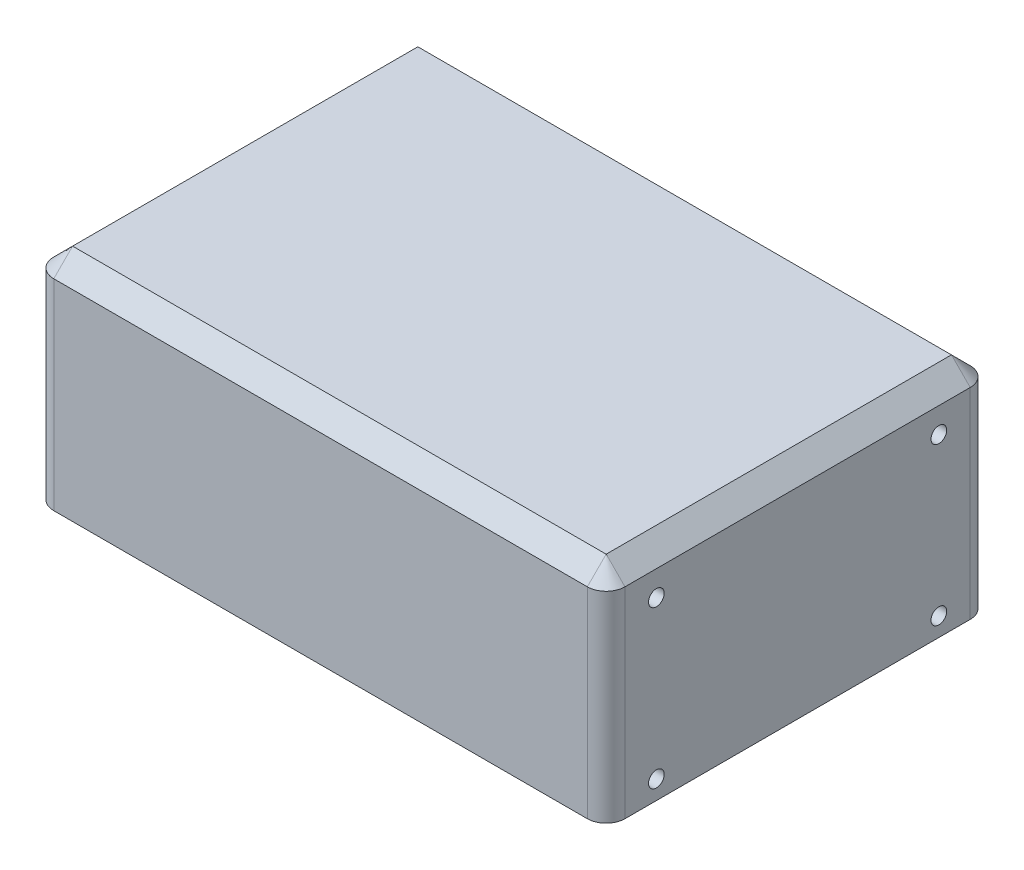
ISO-10303-21;
HEADER;
FILE_DESCRIPTION(('STEP AP214'),'2;1');
FILE_NAME('part.step','',(''),(''),'','','');
FILE_SCHEMA(('AUTOMOTIVE_DESIGN { 1 0 10303 214 1 1 1 1 }'));
ENDSEC;
DATA;
#1=APPLICATION_CONTEXT('core data for automotive mechanical design processes');
#2=APPLICATION_PROTOCOL_DEFINITION('international standard','automotive_design',2000,#1);
#3=PRODUCT_CONTEXT('',#1,'mechanical');
#4=PRODUCT('Part','Part','',(#3));
#5=PRODUCT_RELATED_PRODUCT_CATEGORY('part','',(#4));
#6=PRODUCT_DEFINITION_FORMATION('','',#4);
#7=PRODUCT_DEFINITION_CONTEXT('part definition',#1,'design');
#8=PRODUCT_DEFINITION('design','',#6,#7);
#9=PRODUCT_DEFINITION_SHAPE('','',#8);
#10=(LENGTH_UNIT() NAMED_UNIT(*) SI_UNIT(.MILLI.,.METRE.));
#11=(NAMED_UNIT(*) PLANE_ANGLE_UNIT() SI_UNIT($,.RADIAN.));
#12=(NAMED_UNIT(*) SI_UNIT($,.STERADIAN.) SOLID_ANGLE_UNIT());
#13=UNCERTAINTY_MEASURE_WITH_UNIT(LENGTH_MEASURE(1.E-05),#10,'distance_accuracy_value','');
#14=(GEOMETRIC_REPRESENTATION_CONTEXT(3) GLOBAL_UNCERTAINTY_ASSIGNED_CONTEXT((#13)) GLOBAL_UNIT_ASSIGNED_CONTEXT((#10,
#11,#12)) REPRESENTATION_CONTEXT('',''));
#15=CARTESIAN_POINT('',(0.,0.,0.));
#16=DIRECTION('',(0.,0.,1.));
#17=DIRECTION('',(1.,0.,0.));
#18=AXIS2_PLACEMENT_3D('',#15,#16,#17);
#19=CARTESIAN_POINT('',(0.,35.,0.));
#20=DIRECTION('',(-1.,0.,0.));
#21=DIRECTION('',(0.,0.,1.));
#22=AXIS2_PLACEMENT_3D('',#19,#20,#21);
#23=PLANE('',#22);
#24=CARTESIAN_POINT('',(0.,28.,53.));
#25=DIRECTION('',(1.,0.,0.));
#26=DIRECTION('',(0.,0.,1.));
#27=AXIS2_PLACEMENT_3D('',#24,#25,#26);
#28=CIRCLE('',#27,1.25);
#29=CARTESIAN_POINT('',(0.,28.,54.25));
#30=VERTEX_POINT('',#29);
#31=EDGE_CURVE('E223',#30,#30,#28,.T.);
#32=ORIENTED_EDGE('',*,*,#31,.F.);
#33=EDGE_LOOP('',(#32));
#34=FACE_BOUND('',#33,.T.);
#35=CARTESIAN_POINT('',(0.,3.,53.));
#36=DIRECTION('',(1.,0.,0.));
#37=DIRECTION('',(0.,0.,1.));
#38=AXIS2_PLACEMENT_3D('',#35,#36,#37);
#39=CIRCLE('',#38,1.25);
#40=CARTESIAN_POINT('',(0.,3.,54.25));
#41=VERTEX_POINT('',#40);
#42=EDGE_CURVE('E238',#41,#41,#39,.T.);
#43=ORIENTED_EDGE('',*,*,#42,.F.);
#44=EDGE_LOOP('',(#43));
#45=FACE_BOUND('',#44,.T.);
#46=CARTESIAN_POINT('',(0.,3.,8.));
#47=DIRECTION('',(1.,0.,0.));
#48=DIRECTION('',(0.,0.,-1.));
#49=AXIS2_PLACEMENT_3D('',#46,#47,#48);
#50=CIRCLE('',#49,1.25);
#51=CARTESIAN_POINT('',(0.,3.,6.75));
#52=VERTEX_POINT('',#51);
#53=EDGE_CURVE('E232',#52,#52,#50,.T.);
#54=ORIENTED_EDGE('',*,*,#53,.F.);
#55=EDGE_LOOP('',(#54));
#56=FACE_BOUND('',#55,.T.);
#57=CARTESIAN_POINT('',(0.,28.,8.));
#58=DIRECTION('',(1.,0.,0.));
#59=DIRECTION('',(0.,0.,-1.));
#60=AXIS2_PLACEMENT_3D('',#57,#58,#59);
#61=CIRCLE('',#60,1.25);
#62=CARTESIAN_POINT('',(0.,28.,6.75));
#63=VERTEX_POINT('',#62);
#64=EDGE_CURVE('E231',#63,#63,#61,.T.);
#65=ORIENTED_EDGE('',*,*,#64,.F.);
#66=EDGE_LOOP('',(#65));
#67=FACE_BOUND('',#66,.T.);
#68=DIRECTION('',(0.,-1.,0.));
#69=VECTOR('',#68,1.);
#70=CARTESIAN_POINT('',(0.,35.,3.));
#71=LINE('',#70,#69);
#72=CARTESIAN_POINT('',(0.,0.,3.));
#73=VERTEX_POINT('',#72);
#74=CARTESIAN_POINT('',(0.,32.,3.));
#75=VERTEX_POINT('',#74);
#76=EDGE_CURVE('E153',#73,#75,#71,.F.);
#77=ORIENTED_EDGE('',*,*,#76,.T.);
#78=DIRECTION('',(0.,0.,1.));
#79=VECTOR('',#78,1.);
#80=CARTESIAN_POINT('',(0.,32.,0.));
#81=LINE('',#80,#79);
#82=CARTESIAN_POINT('',(0.,32.,58.));
#83=VERTEX_POINT('',#82);
#84=EDGE_CURVE('E177',#75,#83,#81,.T.);
#85=ORIENTED_EDGE('',*,*,#84,.T.);
#86=DIRECTION('',(0.,-1.,0.));
#87=VECTOR('',#86,1.);
#88=CARTESIAN_POINT('',(0.,35.,58.));
#89=LINE('',#88,#87);
#90=CARTESIAN_POINT('',(0.,0.,58.));
#91=VERTEX_POINT('',#90);
#92=EDGE_CURVE('E151',#83,#91,#89,.T.);
#93=ORIENTED_EDGE('',*,*,#92,.T.);
#94=DIRECTION('',(0.,0.,-1.));
#95=VECTOR('',#94,1.);
#96=CARTESIAN_POINT('',(0.,0.,0.));
#97=LINE('',#96,#95);
#98=EDGE_CURVE('E140',#91,#73,#97,.T.);
#99=ORIENTED_EDGE('',*,*,#98,.T.);
#100=EDGE_LOOP('',(#77,#85,#93,#99));
#101=FACE_BOUND('',#100,.T.);
#102=ADVANCED_FACE('F34',(#34,#45,#56,#67,#101),#23,.F.);
#103=CARTESIAN_POINT('',(0.,35.,0.));
#104=DIRECTION('',(0.,0.,1.));
#105=DIRECTION('',(1.,0.,0.));
#106=AXIS2_PLACEMENT_3D('',#103,#104,#105);
#107=PLANE('',#106);
#108=DIRECTION('',(0.,-1.,0.));
#109=VECTOR('',#108,1.);
#110=CARTESIAN_POINT('',(-88.,35.,0.));
#111=LINE('',#110,#109);
#112=CARTESIAN_POINT('',(-88.,0.,0.));
#113=VERTEX_POINT('',#112);
#114=CARTESIAN_POINT('',(-88.,32.,0.));
#115=VERTEX_POINT('',#114);
#116=EDGE_CURVE('E125',#113,#115,#111,.F.);
#117=ORIENTED_EDGE('',*,*,#116,.T.);
#118=DIRECTION('',(1.,0.,0.));
#119=VECTOR('',#118,1.);
#120=CARTESIAN_POINT('',(0.,32.,0.));
#121=LINE('',#120,#119);
#122=CARTESIAN_POINT('',(-3.,32.,0.));
#123=VERTEX_POINT('',#122);
#124=EDGE_CURVE('E11',#115,#123,#121,.T.);
#125=ORIENTED_EDGE('',*,*,#124,.T.);
#126=DIRECTION('',(0.,-1.,0.));
#127=VECTOR('',#126,1.);
#128=CARTESIAN_POINT('',(-3.,35.,0.));
#129=LINE('',#128,#127);
#130=CARTESIAN_POINT('',(-3.,0.,0.));
#131=VERTEX_POINT('',#130);
#132=EDGE_CURVE('E129',#123,#131,#129,.T.);
#133=ORIENTED_EDGE('',*,*,#132,.T.);
#134=DIRECTION('',(-1.,0.,0.));
#135=VECTOR('',#134,1.);
#136=CARTESIAN_POINT('',(0.,0.,0.));
#137=LINE('',#136,#135);
#138=EDGE_CURVE('E136',#131,#113,#137,.T.);
#139=ORIENTED_EDGE('',*,*,#138,.T.);
#140=EDGE_LOOP('',(#117,#125,#133,#139));
#141=FACE_BOUND('',#140,.T.);
#142=ADVANCED_FACE('F299',(#141),#107,.F.);
#143=CARTESIAN_POINT('',(-91.,35.,0.));
#144=DIRECTION('',(1.,0.,0.));
#145=DIRECTION('',(0.,0.,-1.));
#146=AXIS2_PLACEMENT_3D('',#143,#144,#145);
#147=PLANE('',#146);
#148=CARTESIAN_POINT('',(-91.,28.,53.));
#149=DIRECTION('',(1.,0.,0.));
#150=DIRECTION('',(0.,0.,-1.));
#151=AXIS2_PLACEMENT_3D('',#148,#149,#150);
#152=CIRCLE('',#151,1.25);
#153=CARTESIAN_POINT('',(-91.,28.,51.75));
#154=VERTEX_POINT('',#153);
#155=EDGE_CURVE('E206',#154,#154,#152,.T.);
#156=ORIENTED_EDGE('',*,*,#155,.T.);
#157=EDGE_LOOP('',(#156));
#158=FACE_BOUND('',#157,.T.);
#159=CARTESIAN_POINT('',(-91.,3.,53.));
#160=DIRECTION('',(1.,0.,0.));
#161=DIRECTION('',(0.,0.,-1.));
#162=AXIS2_PLACEMENT_3D('',#159,#160,#161);
#163=CIRCLE('',#162,1.25);
#164=CARTESIAN_POINT('',(-91.,3.,51.75));
#165=VERTEX_POINT('',#164);
#166=EDGE_CURVE('E216',#165,#165,#163,.T.);
#167=ORIENTED_EDGE('',*,*,#166,.T.);
#168=EDGE_LOOP('',(#167));
#169=FACE_BOUND('',#168,.T.);
#170=CARTESIAN_POINT('',(-91.,3.,8.00000000000001));
#171=DIRECTION('',(1.,0.,0.));
#172=DIRECTION('',(0.,0.,-1.));
#173=AXIS2_PLACEMENT_3D('',#170,#171,#172);
#174=CIRCLE('',#173,1.25);
#175=CARTESIAN_POINT('',(-91.,3.,6.75000000000001));
#176=VERTEX_POINT('',#175);
#177=EDGE_CURVE('E648',#176,#176,#174,.T.);
#178=ORIENTED_EDGE('',*,*,#177,.T.);
#179=EDGE_LOOP('',(#178));
#180=FACE_BOUND('',#179,.T.);
#181=CARTESIAN_POINT('',(-91.,28.,8.00000000000001));
#182=DIRECTION('',(1.,0.,0.));
#183=DIRECTION('',(0.,0.,-1.));
#184=AXIS2_PLACEMENT_3D('',#181,#182,#183);
#185=CIRCLE('',#184,1.25);
#186=CARTESIAN_POINT('',(-91.,28.,6.75000000000001));
#187=VERTEX_POINT('',#186);
#188=EDGE_CURVE('E224',#187,#187,#185,.T.);
#189=ORIENTED_EDGE('',*,*,#188,.T.);
#190=EDGE_LOOP('',(#189));
#191=FACE_BOUND('',#190,.T.);
#192=DIRECTION('',(0.,-1.,0.));
#193=VECTOR('',#192,1.);
#194=CARTESIAN_POINT('',(-91.,35.,58.));
#195=LINE('',#194,#193);
#196=CARTESIAN_POINT('',(-91.,0.,58.));
#197=VERTEX_POINT('',#196);
#198=CARTESIAN_POINT('',(-91.,32.,58.));
#199=VERTEX_POINT('',#198);
#200=EDGE_CURVE('E121',#197,#199,#195,.F.);
#201=ORIENTED_EDGE('',*,*,#200,.T.);
#202=DIRECTION('',(0.,0.,-1.));
#203=VECTOR('',#202,1.);
#204=CARTESIAN_POINT('',(-91.,32.,0.));
#205=LINE('',#204,#203);
#206=CARTESIAN_POINT('',(-91.,32.,3.));
#207=VERTEX_POINT('',#206);
#208=EDGE_CURVE('E119',#199,#207,#205,.T.);
#209=ORIENTED_EDGE('',*,*,#208,.T.);
#210=DIRECTION('',(0.,-1.,0.));
#211=VECTOR('',#210,1.);
#212=CARTESIAN_POINT('',(-91.,35.,3.));
#213=LINE('',#212,#211);
#214=CARTESIAN_POINT('',(-91.,0.,3.));
#215=VERTEX_POINT('',#214);
#216=EDGE_CURVE('E111',#207,#215,#213,.T.);
#217=ORIENTED_EDGE('',*,*,#216,.T.);
#218=DIRECTION('',(0.,0.,1.));
#219=VECTOR('',#218,1.);
#220=CARTESIAN_POINT('',(-91.,0.,0.));
#221=LINE('',#220,#219);
#222=EDGE_CURVE('E116',#215,#197,#221,.T.);
#223=ORIENTED_EDGE('',*,*,#222,.T.);
#224=EDGE_LOOP('',(#201,#209,#217,#223));
#225=FACE_BOUND('',#224,.T.);
#226=ADVANCED_FACE('F114',(#158,#169,#180,#191,#225),#147,.F.);
#227=CARTESIAN_POINT('',(0.,35.,61.));
#228=DIRECTION('',(0.,0.,-1.));
#229=DIRECTION('',(-1.,0.,0.));
#230=AXIS2_PLACEMENT_3D('',#227,#228,#229);
#231=PLANE('',#230);
#232=DIRECTION('',(0.,-1.,0.));
#233=VECTOR('',#232,1.);
#234=CARTESIAN_POINT('',(-2.99999999999999,35.,61.));
#235=LINE('',#234,#233);
#236=CARTESIAN_POINT('',(-2.99999999999999,0.,61.));
#237=VERTEX_POINT('',#236);
#238=CARTESIAN_POINT('',(-2.99999999999999,32.,61.));
#239=VERTEX_POINT('',#238);
#240=EDGE_CURVE('E158',#237,#239,#235,.F.);
#241=ORIENTED_EDGE('',*,*,#240,.T.);
#242=DIRECTION('',(-1.,0.,0.));
#243=VECTOR('',#242,1.);
#244=CARTESIAN_POINT('',(0.,32.,61.));
#245=LINE('',#244,#243);
#246=CARTESIAN_POINT('',(-88.,32.,61.));
#247=VERTEX_POINT('',#246);
#248=EDGE_CURVE('E170',#239,#247,#245,.T.);
#249=ORIENTED_EDGE('',*,*,#248,.T.);
#250=DIRECTION('',(0.,-1.,0.));
#251=VECTOR('',#250,1.);
#252=CARTESIAN_POINT('',(-88.,35.,61.));
#253=LINE('',#252,#251);
#254=CARTESIAN_POINT('',(-88.,0.,61.));
#255=VERTEX_POINT('',#254);
#256=EDGE_CURVE('E156',#247,#255,#253,.T.);
#257=ORIENTED_EDGE('',*,*,#256,.T.);
#258=DIRECTION('',(1.,0.,0.));
#259=VECTOR('',#258,1.);
#260=CARTESIAN_POINT('',(0.,0.,61.));
#261=LINE('',#260,#259);
#262=EDGE_CURVE('E135',#255,#237,#261,.T.);
#263=ORIENTED_EDGE('',*,*,#262,.T.);
#264=EDGE_LOOP('',(#241,#249,#257,#263));
#265=FACE_BOUND('',#264,.T.);
#266=ADVANCED_FACE('F270',(#265),#231,.F.);
#267=CARTESIAN_POINT('',(0.,35.,0.));
#268=DIRECTION('',(0.,-1.,0.));
#269=DIRECTION('',(0.,0.,-1.));
#270=AXIS2_PLACEMENT_3D('',#267,#268,#269);
#271=PLANE('',#270);
#272=DIRECTION('',(0.,0.,1.));
#273=VECTOR('',#272,1.);
#274=CARTESIAN_POINT('',(-88.,35.,0.));
#275=LINE('',#274,#273);
#276=CARTESIAN_POINT('',(-88.,35.,3.));
#277=VERTEX_POINT('',#276);
#278=CARTESIAN_POINT('',(-88.,35.,58.));
#279=VERTEX_POINT('',#278);
#280=EDGE_CURVE('E163',#277,#279,#275,.T.);
#281=ORIENTED_EDGE('',*,*,#280,.T.);
#282=DIRECTION('',(1.,0.,0.));
#283=VECTOR('',#282,1.);
#284=CARTESIAN_POINT('',(0.,35.,58.));
#285=LINE('',#284,#283);
#286=CARTESIAN_POINT('',(-3.,35.,58.));
#287=VERTEX_POINT('',#286);
#288=EDGE_CURVE('E167',#279,#287,#285,.T.);
#289=ORIENTED_EDGE('',*,*,#288,.T.);
#290=DIRECTION('',(0.,0.,-1.));
#291=VECTOR('',#290,1.);
#292=CARTESIAN_POINT('',(-3.,35.,0.));
#293=LINE('',#292,#291);
#294=CARTESIAN_POINT('',(-3.,35.,3.));
#295=VERTEX_POINT('',#294);
#296=EDGE_CURVE('E165',#287,#295,#293,.T.);
#297=ORIENTED_EDGE('',*,*,#296,.T.);
#298=DIRECTION('',(-1.,0.,0.));
#299=VECTOR('',#298,1.);
#300=CARTESIAN_POINT('',(0.,35.,3.));
#301=LINE('',#300,#299);
#302=EDGE_CURVE('E161',#295,#277,#301,.T.);
#303=ORIENTED_EDGE('',*,*,#302,.T.);
#304=EDGE_LOOP('',(#281,#289,#297,#303));
#305=FACE_BOUND('',#304,.T.);
#306=ADVANCED_FACE('F288',(#305),#271,.F.);
#307=CARTESIAN_POINT('',(0.,0.,0.));
#308=DIRECTION('',(0.,-1.,0.));
#309=DIRECTION('',(0.,0.,-1.));
#310=AXIS2_PLACEMENT_3D('',#307,#308,#309);
#311=PLANE('',#310);
#312=CARTESIAN_POINT('',(-45.5,0.,44.5));
#313=DIRECTION('',(0.,-1.,0.));
#314=DIRECTION('',(0.,0.,-1.));
#315=AXIS2_PLACEMENT_3D('',#312,#313,#314);
#316=CIRCLE('',#315,1.25);
#317=CARTESIAN_POINT('',(-45.5,0.,43.25));
#318=VERTEX_POINT('',#317);
#319=EDGE_CURVE('E665',#318,#318,#316,.T.);
#320=ORIENTED_EDGE('',*,*,#319,.F.);
#321=EDGE_LOOP('',(#320));
#322=FACE_BOUND('',#321,.T.);
#323=CARTESIAN_POINT('',(-45.5,0.,16.5));
#324=DIRECTION('',(0.,-1.,0.));
#325=DIRECTION('',(0.,0.,-1.));
#326=AXIS2_PLACEMENT_3D('',#323,#324,#325);
#327=CIRCLE('',#326,1.25);
#328=CARTESIAN_POINT('',(-45.5,0.,15.25));
#329=VERTEX_POINT('',#328);
#330=EDGE_CURVE('E659',#329,#329,#327,.T.);
#331=ORIENTED_EDGE('',*,*,#330,.F.);
#332=EDGE_LOOP('',(#331));
#333=FACE_BOUND('',#332,.T.);
#334=ORIENTED_EDGE('',*,*,#222,.F.);
#335=CARTESIAN_POINT('',(-88.,0.,3.));
#336=DIRECTION('',(0.,-1.,0.));
#337=DIRECTION('',(0.,0.,-1.));
#338=AXIS2_PLACEMENT_3D('',#335,#336,#337);
#339=CIRCLE('',#338,3.);
#340=EDGE_CURVE('E123',#215,#113,#339,.T.);
#341=ORIENTED_EDGE('',*,*,#340,.T.);
#342=ORIENTED_EDGE('',*,*,#138,.F.);
#343=CARTESIAN_POINT('',(-3.,0.,3.));
#344=DIRECTION('',(0.,-1.,0.));
#345=DIRECTION('',(0.,0.,-1.));
#346=AXIS2_PLACEMENT_3D('',#343,#344,#345);
#347=CIRCLE('',#346,3.);
#348=EDGE_CURVE('E130',#131,#73,#347,.T.);
#349=ORIENTED_EDGE('',*,*,#348,.T.);
#350=ORIENTED_EDGE('',*,*,#98,.F.);
#351=CARTESIAN_POINT('',(-2.99999999999999,0.,58.));
#352=DIRECTION('',(0.,-1.,0.));
#353=DIRECTION('',(0.,0.,-1.));
#354=AXIS2_PLACEMENT_3D('',#351,#352,#353);
#355=CIRCLE('',#354,3.);
#356=EDGE_CURVE('E146',#91,#237,#355,.T.);
#357=ORIENTED_EDGE('',*,*,#356,.T.);
#358=ORIENTED_EDGE('',*,*,#262,.F.);
#359=CARTESIAN_POINT('',(-88.,0.,58.));
#360=DIRECTION('',(0.,-1.,0.));
#361=DIRECTION('',(0.,0.,-1.));
#362=AXIS2_PLACEMENT_3D('',#359,#360,#361);
#363=CIRCLE('',#362,3.);
#364=EDGE_CURVE('E120',#255,#197,#363,.T.);
#365=ORIENTED_EDGE('',*,*,#364,.T.);
#366=EDGE_LOOP('',(#334,#341,#342,#349,#350,#357,#358,#365));
#367=FACE_BOUND('',#366,.T.);
#368=ADVANCED_FACE('F132',(#322,#333,#367),#311,.T.);
#369=CARTESIAN_POINT('',(-8.,28.,8.));
#370=DIRECTION('',(1.,0.,0.));
#371=DIRECTION('',(0.,0.,-1.));
#372=AXIS2_PLACEMENT_3D('',#369,#370,#371);
#373=CYLINDRICAL_SURFACE('',#372,1.25);
#374=CARTESIAN_POINT('',(-8.,28.,8.));
#375=DIRECTION('',(1.,0.,0.));
#376=DIRECTION('',(0.,0.,-1.));
#377=AXIS2_PLACEMENT_3D('',#374,#375,#376);
#378=CIRCLE('',#377,1.25);
#379=CARTESIAN_POINT('',(-8.,28.,6.75));
#380=VERTEX_POINT('',#379);
#381=EDGE_CURVE('E246',#380,#380,#378,.T.);
#382=ORIENTED_EDGE('',*,*,#381,.F.);
#383=EDGE_LOOP('',(#382));
#384=FACE_BOUND('',#383,.T.);
#385=ORIENTED_EDGE('',*,*,#64,.T.);
#386=EDGE_LOOP('',(#385));
#387=FACE_BOUND('',#386,.T.);
#388=ADVANCED_FACE('F569',(#384,#387),#373,.F.);
#389=CARTESIAN_POINT('',(-8.,28.,8.));
#390=DIRECTION('',(1.,0.,0.));
#391=DIRECTION('',(0.,0.,-1.));
#392=AXIS2_PLACEMENT_3D('',#389,#390,#391);
#393=PLANE('',#392);
#394=ORIENTED_EDGE('',*,*,#381,.T.);
#395=EDGE_LOOP('',(#394));
#396=FACE_BOUND('',#395,.T.);
#397=ADVANCED_FACE('F560',(#396),#393,.T.);
#398=CARTESIAN_POINT('',(-8.,3.,8.));
#399=DIRECTION('',(1.,0.,0.));
#400=DIRECTION('',(0.,0.,-1.));
#401=AXIS2_PLACEMENT_3D('',#398,#399,#400);
#402=CYLINDRICAL_SURFACE('',#401,1.25);
#403=CARTESIAN_POINT('',(-8.,3.,8.));
#404=DIRECTION('',(1.,0.,0.));
#405=DIRECTION('',(0.,0.,-1.));
#406=AXIS2_PLACEMENT_3D('',#403,#404,#405);
#407=CIRCLE('',#406,1.25);
#408=CARTESIAN_POINT('',(-8.,3.,6.75));
#409=VERTEX_POINT('',#408);
#410=EDGE_CURVE('E228',#409,#409,#407,.T.);
#411=ORIENTED_EDGE('',*,*,#410,.F.);
#412=EDGE_LOOP('',(#411));
#413=FACE_BOUND('',#412,.T.);
#414=ORIENTED_EDGE('',*,*,#53,.T.);
#415=EDGE_LOOP('',(#414));
#416=FACE_BOUND('',#415,.T.);
#417=ADVANCED_FACE('F551',(#413,#416),#402,.F.);
#418=CARTESIAN_POINT('',(-8.,3.,8.));
#419=DIRECTION('',(1.,0.,0.));
#420=DIRECTION('',(0.,0.,-1.));
#421=AXIS2_PLACEMENT_3D('',#418,#419,#420);
#422=PLANE('',#421);
#423=ORIENTED_EDGE('',*,*,#410,.T.);
#424=EDGE_LOOP('',(#423));
#425=FACE_BOUND('',#424,.T.);
#426=ADVANCED_FACE('F542',(#425),#422,.T.);
#427=CARTESIAN_POINT('',(-7.99999999999999,3.,53.));
#428=DIRECTION('',(1.,0.,0.));
#429=DIRECTION('',(0.,0.,-1.));
#430=AXIS2_PLACEMENT_3D('',#427,#428,#429);
#431=CYLINDRICAL_SURFACE('',#430,1.25);
#432=CARTESIAN_POINT('',(-7.99999999999999,3.,53.));
#433=DIRECTION('',(1.,0.,0.));
#434=DIRECTION('',(0.,0.,1.));
#435=AXIS2_PLACEMENT_3D('',#432,#433,#434);
#436=CIRCLE('',#435,1.25);
#437=CARTESIAN_POINT('',(-7.99999999999999,3.,54.25));
#438=VERTEX_POINT('',#437);
#439=EDGE_CURVE('E235',#438,#438,#436,.T.);
#440=ORIENTED_EDGE('',*,*,#439,.F.);
#441=EDGE_LOOP('',(#440));
#442=FACE_BOUND('',#441,.T.);
#443=ORIENTED_EDGE('',*,*,#42,.T.);
#444=EDGE_LOOP('',(#443));
#445=FACE_BOUND('',#444,.T.);
#446=ADVANCED_FACE('F533',(#442,#445),#431,.F.);
#447=CARTESIAN_POINT('',(-7.99999999999999,3.,53.));
#448=DIRECTION('',(-1.,0.,0.));
#449=DIRECTION('',(0.,0.,1.));
#450=AXIS2_PLACEMENT_3D('',#447,#448,#449);
#451=PLANE('',#450);
#452=ORIENTED_EDGE('',*,*,#439,.T.);
#453=EDGE_LOOP('',(#452));
#454=FACE_BOUND('',#453,.T.);
#455=ADVANCED_FACE('F524',(#454),#451,.F.);
#456=CARTESIAN_POINT('',(-7.99999999999999,28.,53.));
#457=DIRECTION('',(1.,0.,0.));
#458=DIRECTION('',(0.,0.,-1.));
#459=AXIS2_PLACEMENT_3D('',#456,#457,#458);
#460=CYLINDRICAL_SURFACE('',#459,1.25);
#461=CARTESIAN_POINT('',(-7.99999999999999,28.,53.));
#462=DIRECTION('',(1.,0.,0.));
#463=DIRECTION('',(0.,0.,1.));
#464=AXIS2_PLACEMENT_3D('',#461,#462,#463);
#465=CIRCLE('',#464,1.25);
#466=CARTESIAN_POINT('',(-7.99999999999999,28.,54.25));
#467=VERTEX_POINT('',#466);
#468=EDGE_CURVE('E241',#467,#467,#465,.T.);
#469=ORIENTED_EDGE('',*,*,#468,.F.);
#470=EDGE_LOOP('',(#469));
#471=FACE_BOUND('',#470,.T.);
#472=ORIENTED_EDGE('',*,*,#31,.T.);
#473=EDGE_LOOP('',(#472));
#474=FACE_BOUND('',#473,.T.);
#475=ADVANCED_FACE('F515',(#471,#474),#460,.F.);
#476=CARTESIAN_POINT('',(-7.99999999999999,28.,53.));
#477=DIRECTION('',(-1.,0.,0.));
#478=DIRECTION('',(0.,0.,1.));
#479=AXIS2_PLACEMENT_3D('',#476,#477,#478);
#480=PLANE('',#479);
#481=ORIENTED_EDGE('',*,*,#468,.T.);
#482=EDGE_LOOP('',(#481));
#483=FACE_BOUND('',#482,.T.);
#484=ADVANCED_FACE('F506',(#483),#480,.F.);
#485=CARTESIAN_POINT('',(-83.,28.,8.00000000000001));
#486=DIRECTION('',(-1.,0.,0.));
#487=DIRECTION('',(0.,0.,1.));
#488=AXIS2_PLACEMENT_3D('',#485,#486,#487);
#489=CYLINDRICAL_SURFACE('',#488,1.25);
#490=CARTESIAN_POINT('',(-83.,28.,8.00000000000001));
#491=DIRECTION('',(1.,0.,0.));
#492=DIRECTION('',(0.,0.,-1.));
#493=AXIS2_PLACEMENT_3D('',#490,#491,#492);
#494=CIRCLE('',#493,1.25);
#495=CARTESIAN_POINT('',(-83.,28.,6.75000000000001));
#496=VERTEX_POINT('',#495);
#497=EDGE_CURVE('E220',#496,#496,#494,.T.);
#498=ORIENTED_EDGE('',*,*,#497,.T.);
#499=EDGE_LOOP('',(#498));
#500=FACE_BOUND('',#499,.T.);
#501=ORIENTED_EDGE('',*,*,#188,.F.);
#502=EDGE_LOOP('',(#501));
#503=FACE_BOUND('',#502,.T.);
#504=ADVANCED_FACE('F497',(#500,#503),#489,.F.);
#505=CARTESIAN_POINT('',(-83.,28.,8.00000000000001));
#506=DIRECTION('',(1.,0.,0.));
#507=DIRECTION('',(0.,0.,-1.));
#508=AXIS2_PLACEMENT_3D('',#505,#506,#507);
#509=PLANE('',#508);
#510=ORIENTED_EDGE('',*,*,#497,.F.);
#511=EDGE_LOOP('',(#510));
#512=FACE_BOUND('',#511,.T.);
#513=ADVANCED_FACE('F488',(#512),#509,.F.);
#514=CARTESIAN_POINT('',(-83.,3.,8.00000000000001));
#515=DIRECTION('',(-1.,0.,0.));
#516=DIRECTION('',(0.,0.,1.));
#517=AXIS2_PLACEMENT_3D('',#514,#515,#516);
#518=CYLINDRICAL_SURFACE('',#517,1.25);
#519=CARTESIAN_POINT('',(-83.,3.,8.00000000000001));
#520=DIRECTION('',(1.,0.,0.));
#521=DIRECTION('',(0.,0.,-1.));
#522=AXIS2_PLACEMENT_3D('',#519,#520,#521);
#523=CIRCLE('',#522,1.25);
#524=CARTESIAN_POINT('',(-83.,3.,6.75000000000001));
#525=VERTEX_POINT('',#524);
#526=EDGE_CURVE('E227',#525,#525,#523,.T.);
#527=ORIENTED_EDGE('',*,*,#526,.T.);
#528=EDGE_LOOP('',(#527));
#529=FACE_BOUND('',#528,.T.);
#530=ORIENTED_EDGE('',*,*,#177,.F.);
#531=EDGE_LOOP('',(#530));
#532=FACE_BOUND('',#531,.T.);
#533=ADVANCED_FACE('F479',(#529,#532),#518,.F.);
#534=CARTESIAN_POINT('',(-83.,3.,8.00000000000001));
#535=DIRECTION('',(1.,0.,0.));
#536=DIRECTION('',(0.,0.,-1.));
#537=AXIS2_PLACEMENT_3D('',#534,#535,#536);
#538=PLANE('',#537);
#539=ORIENTED_EDGE('',*,*,#526,.F.);
#540=EDGE_LOOP('',(#539));
#541=FACE_BOUND('',#540,.T.);
#542=ADVANCED_FACE('F470',(#541),#538,.F.);
#543=CARTESIAN_POINT('',(-83.,3.,53.));
#544=DIRECTION('',(-1.,0.,0.));
#545=DIRECTION('',(0.,0.,1.));
#546=AXIS2_PLACEMENT_3D('',#543,#544,#545);
#547=CYLINDRICAL_SURFACE('',#546,1.25);
#548=CARTESIAN_POINT('',(-83.,3.,53.));
#549=DIRECTION('',(1.,0.,0.));
#550=DIRECTION('',(0.,0.,-1.));
#551=AXIS2_PLACEMENT_3D('',#548,#549,#550);
#552=CIRCLE('',#551,1.25);
#553=CARTESIAN_POINT('',(-83.,3.,51.75));
#554=VERTEX_POINT('',#553);
#555=EDGE_CURVE('E652',#554,#554,#552,.T.);
#556=ORIENTED_EDGE('',*,*,#555,.T.);
#557=EDGE_LOOP('',(#556));
#558=FACE_BOUND('',#557,.T.);
#559=ORIENTED_EDGE('',*,*,#166,.F.);
#560=EDGE_LOOP('',(#559));
#561=FACE_BOUND('',#560,.T.);
#562=ADVANCED_FACE('F461',(#558,#561),#547,.F.);
#563=CARTESIAN_POINT('',(-83.,3.,53.));
#564=DIRECTION('',(1.,0.,0.));
#565=DIRECTION('',(0.,0.,-1.));
#566=AXIS2_PLACEMENT_3D('',#563,#564,#565);
#567=PLANE('',#566);
#568=ORIENTED_EDGE('',*,*,#555,.F.);
#569=EDGE_LOOP('',(#568));
#570=FACE_BOUND('',#569,.T.);
#571=ADVANCED_FACE('F452',(#570),#567,.F.);
#572=CARTESIAN_POINT('',(-83.,28.,53.));
#573=DIRECTION('',(-1.,0.,0.));
#574=DIRECTION('',(0.,0.,1.));
#575=AXIS2_PLACEMENT_3D('',#572,#573,#574);
#576=CYLINDRICAL_SURFACE('',#575,1.25);
#577=CARTESIAN_POINT('',(-83.,28.,53.));
#578=DIRECTION('',(1.,0.,0.));
#579=DIRECTION('',(0.,0.,-1.));
#580=AXIS2_PLACEMENT_3D('',#577,#578,#579);
#581=CIRCLE('',#580,1.25);
#582=CARTESIAN_POINT('',(-83.,28.,51.75));
#583=VERTEX_POINT('',#582);
#584=EDGE_CURVE('E211',#583,#583,#581,.T.);
#585=ORIENTED_EDGE('',*,*,#584,.T.);
#586=EDGE_LOOP('',(#585));
#587=FACE_BOUND('',#586,.T.);
#588=ORIENTED_EDGE('',*,*,#155,.F.);
#589=EDGE_LOOP('',(#588));
#590=FACE_BOUND('',#589,.T.);
#591=ADVANCED_FACE('F443',(#587,#590),#576,.F.);
#592=CARTESIAN_POINT('',(-83.,28.,53.));
#593=DIRECTION('',(1.,0.,0.));
#594=DIRECTION('',(0.,0.,-1.));
#595=AXIS2_PLACEMENT_3D('',#592,#593,#594);
#596=PLANE('',#595);
#597=ORIENTED_EDGE('',*,*,#584,.F.);
#598=EDGE_LOOP('',(#597));
#599=FACE_BOUND('',#598,.T.);
#600=ADVANCED_FACE('F312',(#599),#596,.F.);
#601=CARTESIAN_POINT('',(-88.,35.,3.));
#602=DIRECTION('',(0.,-1.,0.));
#603=DIRECTION('',(0.,0.,-1.));
#604=AXIS2_PLACEMENT_3D('',#601,#602,#603);
#605=CYLINDRICAL_SURFACE('',#604,3.);
#606=ORIENTED_EDGE('',*,*,#216,.F.);
#607=CARTESIAN_POINT('',(-88.,32.,3.));
#608=DIRECTION('',(0.,-1.,0.));
#609=DIRECTION('',(0.,0.,-1.));
#610=AXIS2_PLACEMENT_3D('',#607,#608,#609);
#611=CIRCLE('',#610,3.);
#612=EDGE_CURVE('E43',#207,#115,#611,.T.);
#613=ORIENTED_EDGE('',*,*,#612,.T.);
#614=ORIENTED_EDGE('',*,*,#116,.F.);
#615=ORIENTED_EDGE('',*,*,#340,.F.);
#616=EDGE_LOOP('',(#606,#613,#614,#615));
#617=FACE_BOUND('',#616,.T.);
#618=ADVANCED_FACE('F124',(#617),#605,.T.);
#619=CARTESIAN_POINT('',(-3.,35.,3.));
#620=DIRECTION('',(0.,-1.,0.));
#621=DIRECTION('',(0.,0.,-1.));
#622=AXIS2_PLACEMENT_3D('',#619,#620,#621);
#623=CYLINDRICAL_SURFACE('',#622,3.);
#624=ORIENTED_EDGE('',*,*,#132,.F.);
#625=CARTESIAN_POINT('',(-3.,32.,3.));
#626=DIRECTION('',(0.,-1.,0.));
#627=DIRECTION('',(0.,0.,-1.));
#628=AXIS2_PLACEMENT_3D('',#625,#626,#627);
#629=CIRCLE('',#628,3.);
#630=EDGE_CURVE('E180',#123,#75,#629,.T.);
#631=ORIENTED_EDGE('',*,*,#630,.T.);
#632=ORIENTED_EDGE('',*,*,#76,.F.);
#633=ORIENTED_EDGE('',*,*,#348,.F.);
#634=EDGE_LOOP('',(#624,#631,#632,#633));
#635=FACE_BOUND('',#634,.T.);
#636=ADVANCED_FACE('F258',(#635),#623,.T.);
#637=CARTESIAN_POINT('',(-2.99999999999999,35.,58.));
#638=DIRECTION('',(0.,-1.,0.));
#639=DIRECTION('',(0.,0.,-1.));
#640=AXIS2_PLACEMENT_3D('',#637,#638,#639);
#641=CYLINDRICAL_SURFACE('',#640,3.);
#642=ORIENTED_EDGE('',*,*,#92,.F.);
#643=CARTESIAN_POINT('',(-2.99999999999999,32.,58.));
#644=DIRECTION('',(0.,-1.,0.));
#645=DIRECTION('',(0.,0.,-1.));
#646=AXIS2_PLACEMENT_3D('',#643,#644,#645);
#647=CIRCLE('',#646,3.);
#648=EDGE_CURVE('E173',#83,#239,#647,.T.);
#649=ORIENTED_EDGE('',*,*,#648,.T.);
#650=ORIENTED_EDGE('',*,*,#240,.F.);
#651=ORIENTED_EDGE('',*,*,#356,.F.);
#652=EDGE_LOOP('',(#642,#649,#650,#651));
#653=FACE_BOUND('',#652,.T.);
#654=ADVANCED_FACE('F267',(#653),#641,.T.);
#655=CARTESIAN_POINT('',(-88.,35.,58.));
#656=DIRECTION('',(0.,-1.,0.));
#657=DIRECTION('',(0.,0.,-1.));
#658=AXIS2_PLACEMENT_3D('',#655,#656,#657);
#659=CYLINDRICAL_SURFACE('',#658,3.);
#660=ORIENTED_EDGE('',*,*,#256,.F.);
#661=CARTESIAN_POINT('',(-88.,32.,58.));
#662=DIRECTION('',(0.,-1.,0.));
#663=DIRECTION('',(0.,0.,-1.));
#664=AXIS2_PLACEMENT_3D('',#661,#662,#663);
#665=CIRCLE('',#664,3.);
#666=EDGE_CURVE('E175',#247,#199,#665,.T.);
#667=ORIENTED_EDGE('',*,*,#666,.T.);
#668=ORIENTED_EDGE('',*,*,#200,.F.);
#669=ORIENTED_EDGE('',*,*,#364,.F.);
#670=EDGE_LOOP('',(#660,#667,#668,#669));
#671=FACE_BOUND('',#670,.T.);
#672=ADVANCED_FACE('F274',(#671),#659,.T.);
#673=CARTESIAN_POINT('',(0.,35.,3.));
#674=DIRECTION('',(0.,-0.707106781186546,0.707106781186549));
#675=DIRECTION('',(-1.,0.,0.));
#676=AXIS2_PLACEMENT_3D('',#673,#674,#675);
#677=PLANE('',#676);
#678=DIRECTION('',(0.,0.707106781186549,0.707106781186546));
#679=VECTOR('',#678,1.);
#680=CARTESIAN_POINT('',(-3.,32.,0.));
#681=LINE('',#680,#679);
#682=EDGE_CURVE('E199',#123,#295,#681,.T.);
#683=ORIENTED_EDGE('',*,*,#682,.F.);
#684=ORIENTED_EDGE('',*,*,#124,.F.);
#685=DIRECTION('',(0.,-0.707106781186549,-0.707106781186546));
#686=VECTOR('',#685,1.);
#687=CARTESIAN_POINT('',(-88.,35.,3.));
#688=LINE('',#687,#686);
#689=EDGE_CURVE('E38',#277,#115,#688,.T.);
#690=ORIENTED_EDGE('',*,*,#689,.F.);
#691=ORIENTED_EDGE('',*,*,#302,.F.);
#692=EDGE_LOOP('',(#683,#684,#690,#691));
#693=FACE_BOUND('',#692,.T.);
#694=ADVANCED_FACE('F36',(#693),#677,.F.);
#695=CARTESIAN_POINT('',(-88.,32.,3.));
#696=DIRECTION('',(0.,-1.,0.));
#697=DIRECTION('',(0.,0.,-1.));
#698=AXIS2_PLACEMENT_3D('',#695,#696,#697);
#699=CONICAL_SURFACE('',#698,3.,0.785398163397446);
#700=ORIENTED_EDGE('',*,*,#689,.T.);
#701=ORIENTED_EDGE('',*,*,#612,.F.);
#702=DIRECTION('',(-0.707106781186546,-0.707106781186549,0.));
#703=VECTOR('',#702,1.);
#704=CARTESIAN_POINT('',(-88.,35.,3.));
#705=LINE('',#704,#703);
#706=EDGE_CURVE('E197',#277,#207,#705,.T.);
#707=ORIENTED_EDGE('',*,*,#706,.F.);
#708=EDGE_LOOP('',(#700,#701,#707));
#709=FACE_BOUND('',#708,.T.);
#710=ADVANCED_FACE('F291',(#709),#699,.T.);
#711=CARTESIAN_POINT('',(-3.,32.,3.));
#712=DIRECTION('',(0.,-1.,0.));
#713=DIRECTION('',(0.,0.,-1.));
#714=AXIS2_PLACEMENT_3D('',#711,#712,#713);
#715=CONICAL_SURFACE('',#714,3.,0.785398163397446);
#716=ORIENTED_EDGE('',*,*,#630,.F.);
#717=ORIENTED_EDGE('',*,*,#682,.T.);
#718=DIRECTION('',(-0.707106781186546,0.707106781186549,0.));
#719=VECTOR('',#718,1.);
#720=CARTESIAN_POINT('',(0.,32.,3.));
#721=LINE('',#720,#719);
#722=EDGE_CURVE('E194',#75,#295,#721,.T.);
#723=ORIENTED_EDGE('',*,*,#722,.F.);
#724=EDGE_LOOP('',(#716,#717,#723));
#725=FACE_BOUND('',#724,.T.);
#726=ADVANCED_FACE('F259',(#725),#715,.T.);
#727=CARTESIAN_POINT('',(-88.,35.,0.));
#728=DIRECTION('',(0.707106781186549,-0.707106781186546,0.));
#729=DIRECTION('',(0.,0.,1.));
#730=AXIS2_PLACEMENT_3D('',#727,#728,#729);
#731=PLANE('',#730);
#732=ORIENTED_EDGE('',*,*,#706,.T.);
#733=ORIENTED_EDGE('',*,*,#208,.F.);
#734=DIRECTION('',(-0.707106781186546,-0.707106781186549,0.));
#735=VECTOR('',#734,1.);
#736=CARTESIAN_POINT('',(-88.,35.,58.));
#737=LINE('',#736,#735);
#738=EDGE_CURVE('E191',#279,#199,#737,.T.);
#739=ORIENTED_EDGE('',*,*,#738,.F.);
#740=ORIENTED_EDGE('',*,*,#280,.F.);
#741=EDGE_LOOP('',(#732,#733,#739,#740));
#742=FACE_BOUND('',#741,.T.);
#743=ADVANCED_FACE('F278',(#742),#731,.F.);
#744=CARTESIAN_POINT('',(-3.,35.,0.));
#745=DIRECTION('',(-0.707106781186549,-0.707106781186546,0.));
#746=DIRECTION('',(0.,0.,-1.));
#747=AXIS2_PLACEMENT_3D('',#744,#745,#746);
#748=PLANE('',#747);
#749=ORIENTED_EDGE('',*,*,#722,.T.);
#750=ORIENTED_EDGE('',*,*,#296,.F.);
#751=DIRECTION('',(-0.707106781186546,0.707106781186549,0.));
#752=VECTOR('',#751,1.);
#753=CARTESIAN_POINT('',(0.,32.,58.));
#754=LINE('',#753,#752);
#755=EDGE_CURVE('E188',#83,#287,#754,.T.);
#756=ORIENTED_EDGE('',*,*,#755,.F.);
#757=ORIENTED_EDGE('',*,*,#84,.F.);
#758=EDGE_LOOP('',(#749,#750,#756,#757));
#759=FACE_BOUND('',#758,.T.);
#760=ADVANCED_FACE('F264',(#759),#748,.F.);
#761=CARTESIAN_POINT('',(-88.,32.,58.));
#762=DIRECTION('',(0.,-1.,0.));
#763=DIRECTION('',(0.,0.,-1.));
#764=AXIS2_PLACEMENT_3D('',#761,#762,#763);
#765=CONICAL_SURFACE('',#764,3.,0.785398163397446);
#766=ORIENTED_EDGE('',*,*,#738,.T.);
#767=ORIENTED_EDGE('',*,*,#666,.F.);
#768=DIRECTION('',(0.,-0.707106781186549,0.707106781186546));
#769=VECTOR('',#768,1.);
#770=CARTESIAN_POINT('',(-88.,35.,58.));
#771=LINE('',#770,#769);
#772=EDGE_CURVE('E185',#279,#247,#771,.T.);
#773=ORIENTED_EDGE('',*,*,#772,.F.);
#774=EDGE_LOOP('',(#766,#767,#773));
#775=FACE_BOUND('',#774,.T.);
#776=ADVANCED_FACE('F282',(#775),#765,.T.);
#777=CARTESIAN_POINT('',(-2.99999999999999,32.,58.));
#778=DIRECTION('',(0.,-1.,0.));
#779=DIRECTION('',(0.,0.,-1.));
#780=AXIS2_PLACEMENT_3D('',#777,#778,#779);
#781=CONICAL_SURFACE('',#780,3.,0.785398163397446);
#782=ORIENTED_EDGE('',*,*,#648,.F.);
#783=ORIENTED_EDGE('',*,*,#755,.T.);
#784=DIRECTION('',(0.,0.707106781186549,-0.707106781186546));
#785=VECTOR('',#784,1.);
#786=CARTESIAN_POINT('',(-2.99999999999999,32.,61.));
#787=LINE('',#786,#785);
#788=EDGE_CURVE('E183',#239,#287,#787,.T.);
#789=ORIENTED_EDGE('',*,*,#788,.F.);
#790=EDGE_LOOP('',(#782,#783,#789));
#791=FACE_BOUND('',#790,.T.);
#792=ADVANCED_FACE('F322',(#791),#781,.T.);
#793=CARTESIAN_POINT('',(0.,35.,58.));
#794=DIRECTION('',(0.,-0.707106781186546,-0.707106781186549));
#795=DIRECTION('',(1.,0.,0.));
#796=AXIS2_PLACEMENT_3D('',#793,#794,#795);
#797=PLANE('',#796);
#798=ORIENTED_EDGE('',*,*,#772,.T.);
#799=ORIENTED_EDGE('',*,*,#248,.F.);
#800=ORIENTED_EDGE('',*,*,#788,.T.);
#801=ORIENTED_EDGE('',*,*,#288,.F.);
#802=EDGE_LOOP('',(#798,#799,#800,#801));
#803=FACE_BOUND('',#802,.T.);
#804=ADVANCED_FACE('F285',(#803),#797,.F.);
#805=CARTESIAN_POINT('',(-45.5,10.,16.5));
#806=DIRECTION('',(0.,-1.,0.));
#807=DIRECTION('',(0.,0.,-1.));
#808=AXIS2_PLACEMENT_3D('',#805,#806,#807);
#809=CYLINDRICAL_SURFACE('',#808,1.25);
#810=CARTESIAN_POINT('',(-45.5,10.,16.5));
#811=DIRECTION('',(0.,-1.,0.));
#812=DIRECTION('',(0.,0.,-1.));
#813=AXIS2_PLACEMENT_3D('',#810,#811,#812);
#814=CIRCLE('',#813,1.25);
#815=CARTESIAN_POINT('',(-45.5,10.,15.25));
#816=VERTEX_POINT('',#815);
#817=EDGE_CURVE('E662',#816,#816,#814,.T.);
#818=ORIENTED_EDGE('',*,*,#817,.F.);
#819=EDGE_LOOP('',(#818));
#820=FACE_BOUND('',#819,.T.);
#821=ORIENTED_EDGE('',*,*,#330,.T.);
#822=EDGE_LOOP('',(#821));
#823=FACE_BOUND('',#822,.T.);
#824=ADVANCED_FACE('F321',(#820,#823),#809,.F.);
#825=CARTESIAN_POINT('',(-45.5,10.,16.5));
#826=DIRECTION('',(0.,-1.,0.));
#827=DIRECTION('',(0.,0.,-1.));
#828=AXIS2_PLACEMENT_3D('',#825,#826,#827);
#829=PLANE('',#828);
#830=ORIENTED_EDGE('',*,*,#817,.T.);
#831=EDGE_LOOP('',(#830));
#832=FACE_BOUND('',#831,.T.);
#833=ADVANCED_FACE('F358',(#832),#829,.T.);
#834=CARTESIAN_POINT('',(-45.5,10.,44.5));
#835=DIRECTION('',(0.,-1.,0.));
#836=DIRECTION('',(0.,0.,-1.));
#837=AXIS2_PLACEMENT_3D('',#834,#835,#836);
#838=CYLINDRICAL_SURFACE('',#837,1.25);
#839=CARTESIAN_POINT('',(-45.5,10.,44.5));
#840=DIRECTION('',(0.,-1.,0.));
#841=DIRECTION('',(0.,0.,-1.));
#842=AXIS2_PLACEMENT_3D('',#839,#840,#841);
#843=CIRCLE('',#842,1.25);
#844=CARTESIAN_POINT('',(-45.5,10.,43.25));
#845=VERTEX_POINT('',#844);
#846=EDGE_CURVE('E186',#845,#845,#843,.T.);
#847=ORIENTED_EDGE('',*,*,#846,.F.);
#848=EDGE_LOOP('',(#847));
#849=FACE_BOUND('',#848,.T.);
#850=ORIENTED_EDGE('',*,*,#319,.T.);
#851=EDGE_LOOP('',(#850));
#852=FACE_BOUND('',#851,.T.);
#853=ADVANCED_FACE('F366',(#849,#852),#838,.F.);
#854=CARTESIAN_POINT('',(-45.5,10.,44.5));
#855=DIRECTION('',(0.,-1.,0.));
#856=DIRECTION('',(0.,0.,-1.));
#857=AXIS2_PLACEMENT_3D('',#854,#855,#856);
#858=PLANE('',#857);
#859=ORIENTED_EDGE('',*,*,#846,.T.);
#860=EDGE_LOOP('',(#859));
#861=FACE_BOUND('',#860,.T.);
#862=ADVANCED_FACE('F374',(#861),#858,.T.);
#863=CLOSED_SHELL('',(#102,#142,#226,#266,#306,#368,#388,#397,#417,#426,#446,#455,#475,#484,
#504,#513,#533,#542,#562,#571,#591,#600,#618,#636,#654,#672,#694,#710,#726,#743,#760,#776,#792,
#804,#824,#833,#853,#862));
#864=MANIFOLD_SOLID_BREP('B2',#863);
#865=ADVANCED_BREP_SHAPE_REPRESENTATION('',(#18,#864),#14);
#866=SHAPE_DEFINITION_REPRESENTATION(#9,#865);
ENDSEC;
END-ISO-10303-21;
